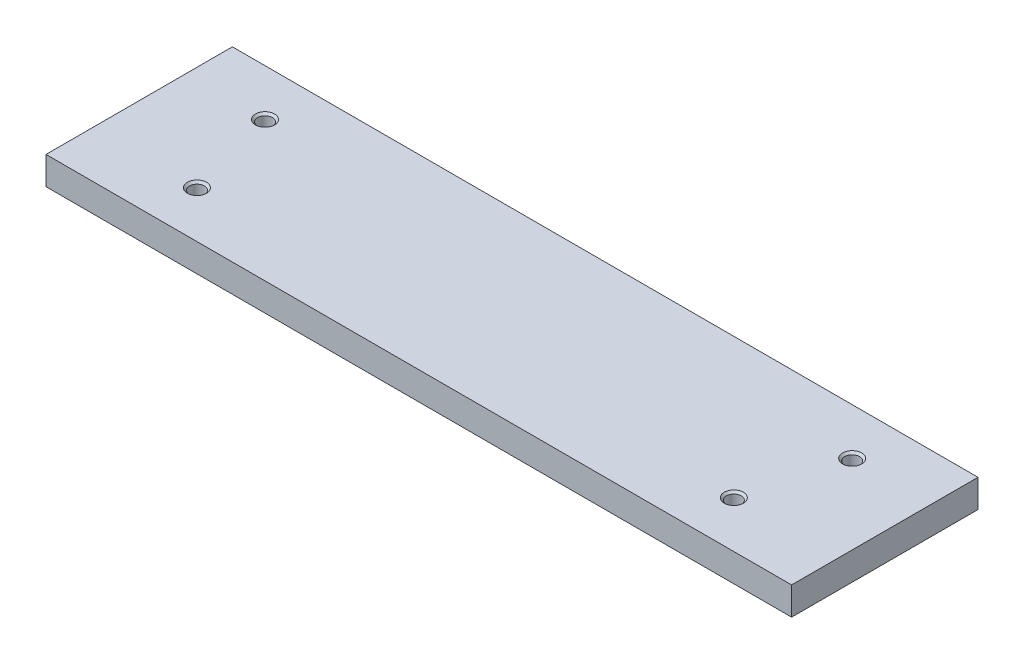
ISO-10303-21;
HEADER;
FILE_DESCRIPTION(('STEP AP214'),'2;1');
FILE_NAME('part.step','',(''),(''),'','','');
FILE_SCHEMA(('AUTOMOTIVE_DESIGN { 1 0 10303 214 1 1 1 1 }'));
ENDSEC;
DATA;
#1=APPLICATION_CONTEXT('core data for automotive mechanical design processes');
#2=APPLICATION_PROTOCOL_DEFINITION('international standard','automotive_design',2000,#1);
#3=PRODUCT_CONTEXT('',#1,'mechanical');
#4=PRODUCT('Part','Part','',(#3));
#5=PRODUCT_RELATED_PRODUCT_CATEGORY('part','',(#4));
#6=PRODUCT_DEFINITION_FORMATION('','',#4);
#7=PRODUCT_DEFINITION_CONTEXT('part definition',#1,'design');
#8=PRODUCT_DEFINITION('design','',#6,#7);
#9=PRODUCT_DEFINITION_SHAPE('','',#8);
#10=(LENGTH_UNIT() NAMED_UNIT(*) SI_UNIT(.MILLI.,.METRE.));
#11=(NAMED_UNIT(*) PLANE_ANGLE_UNIT() SI_UNIT($,.RADIAN.));
#12=(NAMED_UNIT(*) SI_UNIT($,.STERADIAN.) SOLID_ANGLE_UNIT());
#13=UNCERTAINTY_MEASURE_WITH_UNIT(LENGTH_MEASURE(1.E-05),#10,'distance_accuracy_value','');
#14=(GEOMETRIC_REPRESENTATION_CONTEXT(3) GLOBAL_UNCERTAINTY_ASSIGNED_CONTEXT((#13)) GLOBAL_UNIT_ASSIGNED_CONTEXT((#10,
#11,#12)) REPRESENTATION_CONTEXT('',''));
#15=CARTESIAN_POINT('',(0.,0.,0.));
#16=DIRECTION('',(0.,0.,1.));
#17=DIRECTION('',(1.,0.,0.));
#18=AXIS2_PLACEMENT_3D('',#15,#16,#17);
#19=CARTESIAN_POINT('',(0.,3.,0.));
#20=DIRECTION('',(-1.,0.,0.));
#21=DIRECTION('',(0.,0.,1.));
#22=AXIS2_PLACEMENT_3D('',#19,#20,#21);
#23=PLANE('',#22);
#24=DIRECTION('',(0.,0.,-1.));
#25=VECTOR('',#24,1.);
#26=CARTESIAN_POINT('',(0.,0.,0.));
#27=LINE('',#26,#25);
#28=CARTESIAN_POINT('',(0.,0.,0.));
#29=VERTEX_POINT('',#28);
#30=CARTESIAN_POINT('',(0.,0.,-20.));
#31=VERTEX_POINT('',#30);
#32=EDGE_CURVE('E107',#29,#31,#27,.T.);
#33=ORIENTED_EDGE('',*,*,#32,.F.);
#34=DIRECTION('',(0.,-1.,0.));
#35=VECTOR('',#34,1.);
#36=CARTESIAN_POINT('',(0.,3.,0.));
#37=LINE('',#36,#35);
#38=CARTESIAN_POINT('',(0.,3.,0.));
#39=VERTEX_POINT('',#38);
#40=EDGE_CURVE('E11',#39,#29,#37,.T.);
#41=ORIENTED_EDGE('',*,*,#40,.F.);
#42=DIRECTION('',(0.,0.,-1.));
#43=VECTOR('',#42,1.);
#44=CARTESIAN_POINT('',(0.,3.,0.));
#45=LINE('',#44,#43);
#46=CARTESIAN_POINT('',(0.,3.,-20.));
#47=VERTEX_POINT('',#46);
#48=EDGE_CURVE('E101',#39,#47,#45,.T.);
#49=ORIENTED_EDGE('',*,*,#48,.T.);
#50=DIRECTION('',(0.,-1.,0.));
#51=VECTOR('',#50,1.);
#52=CARTESIAN_POINT('',(0.,3.,-20.));
#53=LINE('',#52,#51);
#54=EDGE_CURVE('E44',#47,#31,#53,.T.);
#55=ORIENTED_EDGE('',*,*,#54,.T.);
#56=EDGE_LOOP('',(#33,#41,#49,#55));
#57=FACE_BOUND('',#56,.T.);
#58=ADVANCED_FACE('F41',(#57),#23,.T.);
#59=CARTESIAN_POINT('',(0.,3.,0.));
#60=DIRECTION('',(0.,0.,-1.));
#61=DIRECTION('',(-1.,0.,0.));
#62=AXIS2_PLACEMENT_3D('',#59,#60,#61);
#63=PLANE('',#62);
#64=DIRECTION('',(1.,0.,0.));
#65=VECTOR('',#64,1.);
#66=CARTESIAN_POINT('',(0.,0.,0.));
#67=LINE('',#66,#65);
#68=CARTESIAN_POINT('',(80.,0.,0.));
#69=VERTEX_POINT('',#68);
#70=EDGE_CURVE('E74',#29,#69,#67,.T.);
#71=ORIENTED_EDGE('',*,*,#70,.T.);
#72=DIRECTION('',(0.,-1.,0.));
#73=VECTOR('',#72,1.);
#74=CARTESIAN_POINT('',(80.,3.,0.));
#75=LINE('',#74,#73);
#76=CARTESIAN_POINT('',(80.,3.,0.));
#77=VERTEX_POINT('',#76);
#78=EDGE_CURVE('E50',#77,#69,#75,.T.);
#79=ORIENTED_EDGE('',*,*,#78,.F.);
#80=DIRECTION('',(1.,0.,0.));
#81=VECTOR('',#80,1.);
#82=CARTESIAN_POINT('',(0.,3.,0.));
#83=LINE('',#82,#81);
#84=EDGE_CURVE('E91',#39,#77,#83,.T.);
#85=ORIENTED_EDGE('',*,*,#84,.F.);
#86=ORIENTED_EDGE('',*,*,#40,.T.);
#87=EDGE_LOOP('',(#71,#79,#85,#86));
#88=FACE_BOUND('',#87,.T.);
#89=ADVANCED_FACE('F118',(#88),#63,.F.);
#90=CARTESIAN_POINT('',(80.,3.,0.));
#91=DIRECTION('',(-1.,0.,0.));
#92=DIRECTION('',(0.,0.,1.));
#93=AXIS2_PLACEMENT_3D('',#90,#91,#92);
#94=PLANE('',#93);
#95=DIRECTION('',(0.,0.,-1.));
#96=VECTOR('',#95,1.);
#97=CARTESIAN_POINT('',(80.,0.,0.));
#98=LINE('',#97,#96);
#99=CARTESIAN_POINT('',(80.,0.,-20.));
#100=VERTEX_POINT('',#99);
#101=EDGE_CURVE('E98',#69,#100,#98,.T.);
#102=ORIENTED_EDGE('',*,*,#101,.T.);
#103=DIRECTION('',(0.,-1.,0.));
#104=VECTOR('',#103,1.);
#105=CARTESIAN_POINT('',(80.,3.,-20.));
#106=LINE('',#105,#104);
#107=CARTESIAN_POINT('',(80.,3.,-20.));
#108=VERTEX_POINT('',#107);
#109=EDGE_CURVE('E95',#108,#100,#106,.T.);
#110=ORIENTED_EDGE('',*,*,#109,.F.);
#111=DIRECTION('',(0.,0.,-1.));
#112=VECTOR('',#111,1.);
#113=CARTESIAN_POINT('',(80.,3.,0.));
#114=LINE('',#113,#112);
#115=EDGE_CURVE('E86',#77,#108,#114,.T.);
#116=ORIENTED_EDGE('',*,*,#115,.F.);
#117=ORIENTED_EDGE('',*,*,#78,.T.);
#118=EDGE_LOOP('',(#102,#110,#116,#117));
#119=FACE_BOUND('',#118,.T.);
#120=ADVANCED_FACE('F96',(#119),#94,.F.);
#121=CARTESIAN_POINT('',(0.,3.,-20.));
#122=DIRECTION('',(0.,0.,-1.));
#123=DIRECTION('',(-1.,0.,0.));
#124=AXIS2_PLACEMENT_3D('',#121,#122,#123);
#125=PLANE('',#124);
#126=DIRECTION('',(1.,0.,0.));
#127=VECTOR('',#126,1.);
#128=CARTESIAN_POINT('',(0.,0.,-20.));
#129=LINE('',#128,#127);
#130=EDGE_CURVE('E110',#31,#100,#129,.T.);
#131=ORIENTED_EDGE('',*,*,#130,.F.);
#132=ORIENTED_EDGE('',*,*,#54,.F.);
#133=DIRECTION('',(1.,0.,0.));
#134=VECTOR('',#133,1.);
#135=CARTESIAN_POINT('',(0.,3.,-20.));
#136=LINE('',#135,#134);
#137=EDGE_CURVE('E90',#47,#108,#136,.T.);
#138=ORIENTED_EDGE('',*,*,#137,.T.);
#139=ORIENTED_EDGE('',*,*,#109,.T.);
#140=EDGE_LOOP('',(#131,#132,#138,#139));
#141=FACE_BOUND('',#140,.T.);
#142=ADVANCED_FACE('F100',(#141),#125,.T.);
#143=CARTESIAN_POINT('',(0.,3.,0.));
#144=DIRECTION('',(0.,-1.,0.));
#145=DIRECTION('',(0.,0.,-1.));
#146=AXIS2_PLACEMENT_3D('',#143,#144,#145);
#147=PLANE('',#146);
#148=CARTESIAN_POINT('',(8.5,3.,-15.));
#149=DIRECTION('',(0.,1.,0.));
#150=DIRECTION('',(0.,0.,1.));
#151=AXIS2_PLACEMENT_3D('',#148,#149,#150);
#152=CIRCLE('',#151,1.025);
#153=CARTESIAN_POINT('',(8.5,3.,-13.975));
#154=VERTEX_POINT('',#153);
#155=EDGE_CURVE('E179',#154,#154,#152,.T.);
#156=ORIENTED_EDGE('',*,*,#155,.F.);
#157=EDGE_LOOP('',(#156));
#158=FACE_BOUND('',#157,.T.);
#159=CARTESIAN_POINT('',(11.2,3.,-5.));
#160=DIRECTION('',(0.,1.,0.));
#161=DIRECTION('',(0.,0.,1.));
#162=AXIS2_PLACEMENT_3D('',#159,#160,#161);
#163=CIRCLE('',#162,1.025);
#164=CARTESIAN_POINT('',(11.2,3.,-3.975));
#165=VERTEX_POINT('',#164);
#166=EDGE_CURVE('E186',#165,#165,#163,.T.);
#167=ORIENTED_EDGE('',*,*,#166,.F.);
#168=EDGE_LOOP('',(#167));
#169=FACE_BOUND('',#168,.T.);
#170=CARTESIAN_POINT('',(71.5,3.,-14.9999999999999));
#171=DIRECTION('',(0.,1.,0.));
#172=DIRECTION('',(0.,0.,1.));
#173=AXIS2_PLACEMENT_3D('',#170,#171,#172);
#174=CIRCLE('',#173,1.025);
#175=CARTESIAN_POINT('',(71.5,3.,-13.9749999999999));
#176=VERTEX_POINT('',#175);
#177=EDGE_CURVE('E195',#176,#176,#174,.T.);
#178=ORIENTED_EDGE('',*,*,#177,.F.);
#179=EDGE_LOOP('',(#178));
#180=FACE_BOUND('',#179,.T.);
#181=CARTESIAN_POINT('',(68.8,3.,-4.99999999999994));
#182=DIRECTION('',(0.,1.,0.));
#183=DIRECTION('',(0.,0.,1.));
#184=AXIS2_PLACEMENT_3D('',#181,#182,#183);
#185=CIRCLE('',#184,1.025);
#186=CARTESIAN_POINT('',(68.8,3.,-3.97499999999994));
#187=VERTEX_POINT('',#186);
#188=EDGE_CURVE('E204',#187,#187,#185,.T.);
#189=ORIENTED_EDGE('',*,*,#188,.F.);
#190=EDGE_LOOP('',(#189));
#191=FACE_BOUND('',#190,.T.);
#192=ORIENTED_EDGE('',*,*,#48,.F.);
#193=ORIENTED_EDGE('',*,*,#84,.T.);
#194=ORIENTED_EDGE('',*,*,#115,.T.);
#195=ORIENTED_EDGE('',*,*,#137,.F.);
#196=EDGE_LOOP('',(#192,#193,#194,#195));
#197=FACE_BOUND('',#196,.T.);
#198=ADVANCED_FACE('F89',(#158,#169,#180,#191,#197),#147,.F.);
#199=CARTESIAN_POINT('',(0.,0.,0.));
#200=DIRECTION('',(0.,-1.,0.));
#201=DIRECTION('',(0.,0.,-1.));
#202=AXIS2_PLACEMENT_3D('',#199,#200,#201);
#203=PLANE('',#202);
#204=CARTESIAN_POINT('',(8.5,0.,-15.));
#205=DIRECTION('',(0.,1.,0.));
#206=DIRECTION('',(0.,0.,1.));
#207=AXIS2_PLACEMENT_3D('',#204,#205,#206);
#208=CIRCLE('',#207,0.8);
#209=CARTESIAN_POINT('',(8.5,0.,-14.2));
#210=VERTEX_POINT('',#209);
#211=EDGE_CURVE('E181',#210,#210,#208,.T.);
#212=ORIENTED_EDGE('',*,*,#211,.T.);
#213=EDGE_LOOP('',(#212));
#214=FACE_BOUND('',#213,.T.);
#215=CARTESIAN_POINT('',(11.2,0.,-5.));
#216=DIRECTION('',(0.,1.,0.));
#217=DIRECTION('',(0.,0.,1.));
#218=AXIS2_PLACEMENT_3D('',#215,#216,#217);
#219=CIRCLE('',#218,0.8);
#220=CARTESIAN_POINT('',(11.2,0.,-4.2));
#221=VERTEX_POINT('',#220);
#222=EDGE_CURVE('E192',#221,#221,#219,.T.);
#223=ORIENTED_EDGE('',*,*,#222,.T.);
#224=EDGE_LOOP('',(#223));
#225=FACE_BOUND('',#224,.T.);
#226=CARTESIAN_POINT('',(71.5,0.,-14.9999999999999));
#227=DIRECTION('',(0.,1.,0.));
#228=DIRECTION('',(0.,0.,1.));
#229=AXIS2_PLACEMENT_3D('',#226,#227,#228);
#230=CIRCLE('',#229,0.799999999999995);
#231=CARTESIAN_POINT('',(71.5,0.,-14.1999999999999));
#232=VERTEX_POINT('',#231);
#233=EDGE_CURVE('E201',#232,#232,#230,.T.);
#234=ORIENTED_EDGE('',*,*,#233,.T.);
#235=EDGE_LOOP('',(#234));
#236=FACE_BOUND('',#235,.T.);
#237=CARTESIAN_POINT('',(68.8,0.,-4.99999999999994));
#238=DIRECTION('',(0.,1.,0.));
#239=DIRECTION('',(0.,0.,1.));
#240=AXIS2_PLACEMENT_3D('',#237,#238,#239);
#241=CIRCLE('',#240,0.799999999999995);
#242=CARTESIAN_POINT('',(68.8,0.,-4.19999999999995));
#243=VERTEX_POINT('',#242);
#244=EDGE_CURVE('E111',#243,#243,#241,.T.);
#245=ORIENTED_EDGE('',*,*,#244,.T.);
#246=EDGE_LOOP('',(#245));
#247=FACE_BOUND('',#246,.T.);
#248=ORIENTED_EDGE('',*,*,#32,.T.);
#249=ORIENTED_EDGE('',*,*,#130,.T.);
#250=ORIENTED_EDGE('',*,*,#101,.F.);
#251=ORIENTED_EDGE('',*,*,#70,.F.);
#252=EDGE_LOOP('',(#248,#249,#250,#251));
#253=FACE_BOUND('',#252,.T.);
#254=ADVANCED_FACE('F116',(#214,#225,#236,#247,#253),#203,.T.);
#255=CARTESIAN_POINT('',(68.8,3.,-4.99999999999994));
#256=DIRECTION('',(0.,1.,0.));
#257=DIRECTION('',(0.,0.,1.));
#258=AXIS2_PLACEMENT_3D('',#255,#256,#257);
#259=CYLINDRICAL_SURFACE('',#258,0.799999999999995);
#260=ORIENTED_EDGE('',*,*,#244,.F.);
#261=EDGE_LOOP('',(#260));
#262=FACE_BOUND('',#261,.T.);
#263=CARTESIAN_POINT('',(68.8,2.775,-4.99999999999994));
#264=DIRECTION('',(0.,1.,0.));
#265=DIRECTION('',(0.,0.,1.));
#266=AXIS2_PLACEMENT_3D('',#263,#264,#265);
#267=CIRCLE('',#266,0.799999999999995);
#268=CARTESIAN_POINT('',(68.8,2.775,-4.19999999999995));
#269=VERTEX_POINT('',#268);
#270=EDGE_CURVE('E207',#269,#269,#267,.T.);
#271=ORIENTED_EDGE('',*,*,#270,.T.);
#272=EDGE_LOOP('',(#271));
#273=FACE_BOUND('',#272,.T.);
#274=ADVANCED_FACE('F137',(#262,#273),#259,.F.);
#275=CARTESIAN_POINT('',(68.8,3.,-4.99999999999994));
#276=DIRECTION('',(0.,1.,0.));
#277=DIRECTION('',(0.,0.,1.));
#278=AXIS2_PLACEMENT_3D('',#275,#276,#277);
#279=CONICAL_SURFACE('',#278,1.025,0.785398163397456);
#280=ORIENTED_EDGE('',*,*,#270,.F.);
#281=EDGE_LOOP('',(#280));
#282=FACE_BOUND('',#281,.T.);
#283=ORIENTED_EDGE('',*,*,#188,.T.);
#284=EDGE_LOOP('',(#283));
#285=FACE_BOUND('',#284,.T.);
#286=ADVANCED_FACE('F144',(#282,#285),#279,.F.);
#287=CARTESIAN_POINT('',(71.5,3.,-14.9999999999999));
#288=DIRECTION('',(0.,1.,0.));
#289=DIRECTION('',(0.,0.,1.));
#290=AXIS2_PLACEMENT_3D('',#287,#288,#289);
#291=CYLINDRICAL_SURFACE('',#290,0.799999999999995);
#292=ORIENTED_EDGE('',*,*,#233,.F.);
#293=EDGE_LOOP('',(#292));
#294=FACE_BOUND('',#293,.T.);
#295=CARTESIAN_POINT('',(71.5,2.775,-14.9999999999999));
#296=DIRECTION('',(0.,1.,0.));
#297=DIRECTION('',(0.,0.,1.));
#298=AXIS2_PLACEMENT_3D('',#295,#296,#297);
#299=CIRCLE('',#298,0.799999999999995);
#300=CARTESIAN_POINT('',(71.5,2.775,-14.1999999999999));
#301=VERTEX_POINT('',#300);
#302=EDGE_CURVE('E198',#301,#301,#299,.T.);
#303=ORIENTED_EDGE('',*,*,#302,.T.);
#304=EDGE_LOOP('',(#303));
#305=FACE_BOUND('',#304,.T.);
#306=ADVANCED_FACE('F148',(#294,#305),#291,.F.);
#307=CARTESIAN_POINT('',(71.5,3.,-14.9999999999999));
#308=DIRECTION('',(0.,1.,0.));
#309=DIRECTION('',(0.,0.,1.));
#310=AXIS2_PLACEMENT_3D('',#307,#308,#309);
#311=CONICAL_SURFACE('',#310,1.025,0.785398163397456);
#312=ORIENTED_EDGE('',*,*,#302,.F.);
#313=EDGE_LOOP('',(#312));
#314=FACE_BOUND('',#313,.T.);
#315=ORIENTED_EDGE('',*,*,#177,.T.);
#316=EDGE_LOOP('',(#315));
#317=FACE_BOUND('',#316,.T.);
#318=ADVANCED_FACE('F152',(#314,#317),#311,.F.);
#319=CARTESIAN_POINT('',(11.2,3.,-5.));
#320=DIRECTION('',(0.,1.,0.));
#321=DIRECTION('',(0.,0.,1.));
#322=AXIS2_PLACEMENT_3D('',#319,#320,#321);
#323=CYLINDRICAL_SURFACE('',#322,0.8);
#324=ORIENTED_EDGE('',*,*,#222,.F.);
#325=EDGE_LOOP('',(#324));
#326=FACE_BOUND('',#325,.T.);
#327=CARTESIAN_POINT('',(11.2,2.775,-5.));
#328=DIRECTION('',(0.,1.,0.));
#329=DIRECTION('',(0.,0.,1.));
#330=AXIS2_PLACEMENT_3D('',#327,#328,#329);
#331=CIRCLE('',#330,0.8);
#332=CARTESIAN_POINT('',(11.2,2.775,-4.2));
#333=VERTEX_POINT('',#332);
#334=EDGE_CURVE('E189',#333,#333,#331,.T.);
#335=ORIENTED_EDGE('',*,*,#334,.T.);
#336=EDGE_LOOP('',(#335));
#337=FACE_BOUND('',#336,.T.);
#338=ADVANCED_FACE('F156',(#326,#337),#323,.F.);
#339=CARTESIAN_POINT('',(11.2,3.,-5.));
#340=DIRECTION('',(0.,1.,0.));
#341=DIRECTION('',(0.,0.,1.));
#342=AXIS2_PLACEMENT_3D('',#339,#340,#341);
#343=CONICAL_SURFACE('',#342,1.025,0.785398163397448);
#344=ORIENTED_EDGE('',*,*,#334,.F.);
#345=EDGE_LOOP('',(#344));
#346=FACE_BOUND('',#345,.T.);
#347=ORIENTED_EDGE('',*,*,#166,.T.);
#348=EDGE_LOOP('',(#347));
#349=FACE_BOUND('',#348,.T.);
#350=ADVANCED_FACE('F160',(#346,#349),#343,.F.);
#351=CARTESIAN_POINT('',(8.5,3.,-15.));
#352=DIRECTION('',(0.,1.,0.));
#353=DIRECTION('',(0.,0.,1.));
#354=AXIS2_PLACEMENT_3D('',#351,#352,#353);
#355=CYLINDRICAL_SURFACE('',#354,0.8);
#356=ORIENTED_EDGE('',*,*,#211,.F.);
#357=EDGE_LOOP('',(#356));
#358=FACE_BOUND('',#357,.T.);
#359=CARTESIAN_POINT('',(8.5,2.775,-15.));
#360=DIRECTION('',(0.,1.,0.));
#361=DIRECTION('',(0.,0.,1.));
#362=AXIS2_PLACEMENT_3D('',#359,#360,#361);
#363=CIRCLE('',#362,0.8);
#364=CARTESIAN_POINT('',(8.5,2.775,-14.2));
#365=VERTEX_POINT('',#364);
#366=EDGE_CURVE('E177',#365,#365,#363,.T.);
#367=ORIENTED_EDGE('',*,*,#366,.T.);
#368=EDGE_LOOP('',(#367));
#369=FACE_BOUND('',#368,.T.);
#370=ADVANCED_FACE('F164',(#358,#369),#355,.F.);
#371=CARTESIAN_POINT('',(8.5,3.,-15.));
#372=DIRECTION('',(0.,1.,0.));
#373=DIRECTION('',(0.,0.,1.));
#374=AXIS2_PLACEMENT_3D('',#371,#372,#373);
#375=CONICAL_SURFACE('',#374,1.025,0.785398163397448);
#376=ORIENTED_EDGE('',*,*,#366,.F.);
#377=EDGE_LOOP('',(#376));
#378=FACE_BOUND('',#377,.T.);
#379=ORIENTED_EDGE('',*,*,#155,.T.);
#380=EDGE_LOOP('',(#379));
#381=FACE_BOUND('',#380,.T.);
#382=ADVANCED_FACE('F168',(#378,#381),#375,.F.);
#383=CLOSED_SHELL('',(#58,#89,#120,#142,#198,#254,#274,#286,#306,#318,#338,#350,#370,#382));
#384=MANIFOLD_SOLID_BREP('B2',#383);
#385=ADVANCED_BREP_SHAPE_REPRESENTATION('',(#18,#384),#14);
#386=SHAPE_DEFINITION_REPRESENTATION(#9,#385);
ENDSEC;
END-ISO-10303-21;
